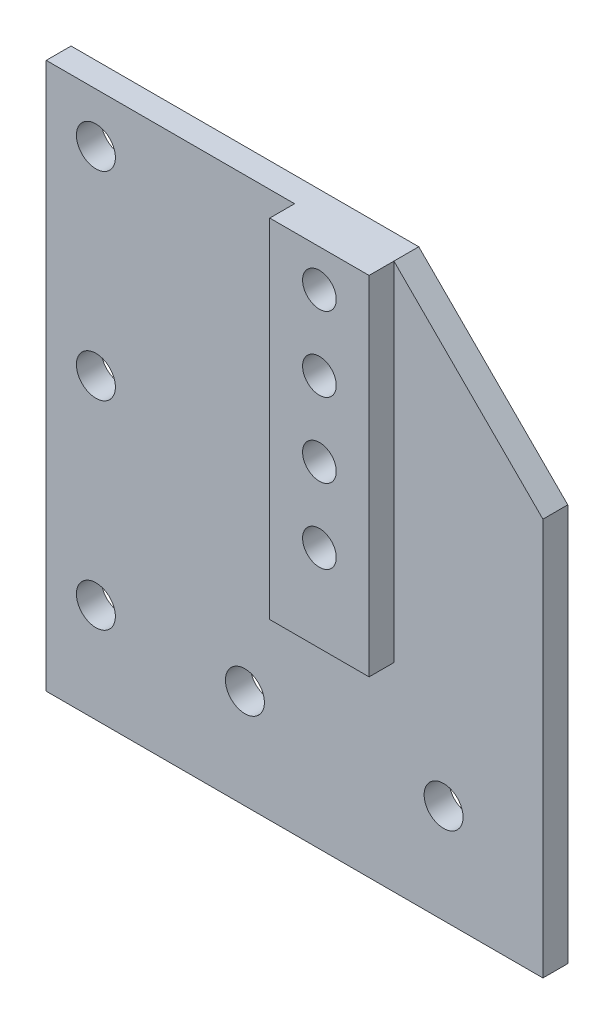
ISO-10303-21;
HEADER;
FILE_DESCRIPTION(('STEP AP214'),'2;1');
FILE_NAME('part.step','',(''),(''),'','','');
FILE_SCHEMA(('AUTOMOTIVE_DESIGN { 1 0 10303 214 1 1 1 1 }'));
ENDSEC;
DATA;
#1=APPLICATION_CONTEXT('core data for automotive mechanical design processes');
#2=APPLICATION_PROTOCOL_DEFINITION('international standard','automotive_design',2000,#1);
#3=PRODUCT_CONTEXT('',#1,'mechanical');
#4=PRODUCT('Part','Part','',(#3));
#5=PRODUCT_RELATED_PRODUCT_CATEGORY('part','',(#4));
#6=PRODUCT_DEFINITION_FORMATION('','',#4);
#7=PRODUCT_DEFINITION_CONTEXT('part definition',#1,'design');
#8=PRODUCT_DEFINITION('design','',#6,#7);
#9=PRODUCT_DEFINITION_SHAPE('','',#8);
#10=(LENGTH_UNIT() NAMED_UNIT(*) SI_UNIT(.MILLI.,.METRE.));
#11=(NAMED_UNIT(*) PLANE_ANGLE_UNIT() SI_UNIT($,.RADIAN.));
#12=(NAMED_UNIT(*) SI_UNIT($,.STERADIAN.) SOLID_ANGLE_UNIT());
#13=UNCERTAINTY_MEASURE_WITH_UNIT(LENGTH_MEASURE(1.E-05),#10,'distance_accuracy_value','');
#14=(GEOMETRIC_REPRESENTATION_CONTEXT(3) GLOBAL_UNCERTAINTY_ASSIGNED_CONTEXT((#13)) GLOBAL_UNIT_ASSIGNED_CONTEXT((#10,
#11,#12)) REPRESENTATION_CONTEXT('',''));
#15=CARTESIAN_POINT('',(0.,0.,0.));
#16=DIRECTION('',(0.,0.,1.));
#17=DIRECTION('',(1.,0.,0.));
#18=AXIS2_PLACEMENT_3D('',#15,#16,#17);
#19=CARTESIAN_POINT('',(-203.200000508,12.7,3.175));
#20=DIRECTION('',(-1.,0.,0.));
#21=DIRECTION('',(0.,0.,1.));
#22=AXIS2_PLACEMENT_3D('',#19,#20,#21);
#23=PLANE('',#22);
#24=DIRECTION('',(0.,1.,0.));
#25=VECTOR('',#24,1.);
#26=CARTESIAN_POINT('',(-203.200000508,12.7,0.));
#27=LINE('',#26,#25);
#28=CARTESIAN_POINT('',(-203.200000508,-12.7,0.));
#29=VERTEX_POINT('',#28);
#30=CARTESIAN_POINT('',(-203.200000508,38.1,0.));
#31=VERTEX_POINT('',#30);
#32=EDGE_CURVE('E160',#29,#31,#27,.T.);
#33=ORIENTED_EDGE('',*,*,#32,.T.);
#34=DIRECTION('',(0.,0.,-1.));
#35=VECTOR('',#34,1.);
#36=CARTESIAN_POINT('',(-203.200000508,38.1,3.175));
#37=LINE('',#36,#35);
#38=CARTESIAN_POINT('',(-203.200000508,38.1,3.175));
#39=VERTEX_POINT('',#38);
#40=EDGE_CURVE('E44',#39,#31,#37,.T.);
#41=ORIENTED_EDGE('',*,*,#40,.F.);
#42=DIRECTION('',(0.,1.,0.));
#43=VECTOR('',#42,1.);
#44=CARTESIAN_POINT('',(-203.200000508,-12.7,3.175));
#45=LINE('',#44,#43);
#46=CARTESIAN_POINT('',(-203.200000508,-12.7,3.175));
#47=VERTEX_POINT('',#46);
#48=EDGE_CURVE('E164',#47,#39,#45,.T.);
#49=ORIENTED_EDGE('',*,*,#48,.F.);
#50=DIRECTION('',(0.,0.,-1.));
#51=VECTOR('',#50,1.);
#52=CARTESIAN_POINT('',(-203.200000508,-12.7,3.175));
#53=LINE('',#52,#51);
#54=EDGE_CURVE('E11',#47,#29,#53,.T.);
#55=ORIENTED_EDGE('',*,*,#54,.T.);
#56=EDGE_LOOP('',(#33,#41,#49,#55));
#57=FACE_BOUND('',#56,.T.);
#58=ADVANCED_FACE('F37',(#57),#23,.F.);
#59=CARTESIAN_POINT('',(-222.250000508,57.1499999999999,3.175));
#60=DIRECTION('',(-0.707106781186548,-0.707106781186548,0.));
#61=DIRECTION('',(0.707106781186548,-0.707106781186548,0.));
#62=AXIS2_PLACEMENT_3D('',#59,#60,#61);
#63=PLANE('',#62);
#64=DIRECTION('',(-0.707106781186547,0.707106781186547,0.));
#65=VECTOR('',#64,1.);
#66=CARTESIAN_POINT('',(-222.250000508,57.1499999999999,0.));
#67=LINE('',#66,#65);
#68=CARTESIAN_POINT('',(-222.250000508,57.1499999999999,0.));
#69=VERTEX_POINT('',#68);
#70=EDGE_CURVE('E176',#31,#69,#67,.T.);
#71=ORIENTED_EDGE('',*,*,#70,.T.);
#72=DIRECTION('',(0.,0.,-1.));
#73=VECTOR('',#72,1.);
#74=CARTESIAN_POINT('',(-222.250000508,57.1499999999999,3.175));
#75=LINE('',#74,#73);
#76=CARTESIAN_POINT('',(-222.250000508,57.1499999999999,3.175));
#77=VERTEX_POINT('',#76);
#78=EDGE_CURVE('E190',#77,#69,#75,.T.);
#79=ORIENTED_EDGE('',*,*,#78,.F.);
#80=DIRECTION('',(-0.707106781186547,0.707106781186547,0.));
#81=VECTOR('',#80,1.);
#82=CARTESIAN_POINT('',(-222.250000508,57.1499999999999,3.175));
#83=LINE('',#82,#81);
#84=EDGE_CURVE('E167',#39,#77,#83,.T.);
#85=ORIENTED_EDGE('',*,*,#84,.F.);
#86=ORIENTED_EDGE('',*,*,#40,.T.);
#87=EDGE_LOOP('',(#71,#79,#85,#86));
#88=FACE_BOUND('',#87,.T.);
#89=ADVANCED_FACE('F196',(#88),#63,.F.);
#90=CARTESIAN_POINT('',(-266.700000508,57.1499999999999,3.175));
#91=DIRECTION('',(0.,-1.,0.));
#92=DIRECTION('',(0.,0.,-1.));
#93=AXIS2_PLACEMENT_3D('',#90,#91,#92);
#94=PLANE('',#93);
#95=DIRECTION('',(-1.,0.,0.));
#96=VECTOR('',#95,1.);
#97=CARTESIAN_POINT('',(-266.700000508,57.1499999999999,0.));
#98=LINE('',#97,#96);
#99=CARTESIAN_POINT('',(-266.700000508,57.1499999999999,0.));
#100=VERTEX_POINT('',#99);
#101=EDGE_CURVE('E179',#69,#100,#98,.T.);
#102=ORIENTED_EDGE('',*,*,#101,.T.);
#103=DIRECTION('',(0.,0.,-1.));
#104=VECTOR('',#103,1.);
#105=CARTESIAN_POINT('',(-266.700000508,57.1499999999999,3.175));
#106=LINE('',#105,#104);
#107=CARTESIAN_POINT('',(-266.700000508,57.1499999999999,3.175));
#108=VERTEX_POINT('',#107);
#109=EDGE_CURVE('E187',#108,#100,#106,.T.);
#110=ORIENTED_EDGE('',*,*,#109,.F.);
#111=DIRECTION('',(-1.,0.,0.));
#112=VECTOR('',#111,1.);
#113=CARTESIAN_POINT('',(-254.000000508,57.1499999999999,3.175));
#114=LINE('',#113,#112);
#115=CARTESIAN_POINT('',(-234.950000508,57.1499999999999,3.175));
#116=VERTEX_POINT('',#115);
#117=EDGE_CURVE('E169',#116,#108,#114,.T.);
#118=ORIENTED_EDGE('',*,*,#117,.F.);
#119=DIRECTION('',(0.,0.,-1.));
#120=VECTOR('',#119,1.);
#121=CARTESIAN_POINT('',(-234.950000508,57.1499999999999,6.35));
#122=LINE('',#121,#120);
#123=CARTESIAN_POINT('',(-234.950000508,57.1499999999999,6.35));
#124=VERTEX_POINT('',#123);
#125=EDGE_CURVE('E110',#124,#116,#122,.T.);
#126=ORIENTED_EDGE('',*,*,#125,.F.);
#127=DIRECTION('',(-1.,0.,0.));
#128=VECTOR('',#127,1.);
#129=CARTESIAN_POINT('',(-222.250000508,57.1499999999999,6.35));
#130=LINE('',#129,#128);
#131=CARTESIAN_POINT('',(-222.250000508,57.1499999999999,6.35));
#132=VERTEX_POINT('',#131);
#133=EDGE_CURVE('E103',#132,#124,#130,.T.);
#134=ORIENTED_EDGE('',*,*,#133,.F.);
#135=DIRECTION('',(0.,0.,-1.));
#136=VECTOR('',#135,1.);
#137=CARTESIAN_POINT('',(-222.250000508,57.1499999999999,6.35));
#138=LINE('',#137,#136);
#139=EDGE_CURVE('E108',#132,#77,#138,.T.);
#140=ORIENTED_EDGE('',*,*,#139,.T.);
#141=ORIENTED_EDGE('',*,*,#78,.T.);
#142=EDGE_LOOP('',(#102,#110,#118,#126,#134,#140,#141));
#143=FACE_BOUND('',#142,.T.);
#144=ADVANCED_FACE('F105',(#143),#94,.F.);
#145=CARTESIAN_POINT('',(-266.700000508,-12.7,3.175));
#146=DIRECTION('',(1.,0.,0.));
#147=DIRECTION('',(0.,1.,0.));
#148=AXIS2_PLACEMENT_3D('',#145,#146,#147);
#149=PLANE('',#148);
#150=DIRECTION('',(0.,-1.,0.));
#151=VECTOR('',#150,1.);
#152=CARTESIAN_POINT('',(-266.700000508,-12.7,0.));
#153=LINE('',#152,#151);
#154=CARTESIAN_POINT('',(-266.700000508,-12.7,0.));
#155=VERTEX_POINT('',#154);
#156=EDGE_CURVE('E181',#100,#155,#153,.T.);
#157=ORIENTED_EDGE('',*,*,#156,.T.);
#158=DIRECTION('',(0.,0.,-1.));
#159=VECTOR('',#158,1.);
#160=CARTESIAN_POINT('',(-266.700000508,-12.7,3.175));
#161=LINE('',#160,#159);
#162=CARTESIAN_POINT('',(-266.700000508,-12.7,3.175));
#163=VERTEX_POINT('',#162);
#164=EDGE_CURVE('E174',#163,#155,#161,.T.);
#165=ORIENTED_EDGE('',*,*,#164,.F.);
#166=DIRECTION('',(0.,-1.,0.));
#167=VECTOR('',#166,1.);
#168=CARTESIAN_POINT('',(-266.700000508,-12.7,3.175));
#169=LINE('',#168,#167);
#170=EDGE_CURVE('E171',#108,#163,#169,.T.);
#171=ORIENTED_EDGE('',*,*,#170,.F.);
#172=ORIENTED_EDGE('',*,*,#109,.T.);
#173=EDGE_LOOP('',(#157,#165,#171,#172));
#174=FACE_BOUND('',#173,.T.);
#175=ADVANCED_FACE('F206',(#174),#149,.F.);
#176=CARTESIAN_POINT('',(-254.000000508,-12.7,3.175));
#177=DIRECTION('',(0.,1.,0.));
#178=DIRECTION('',(-1.,0.,0.));
#179=AXIS2_PLACEMENT_3D('',#176,#177,#178);
#180=PLANE('',#179);
#181=DIRECTION('',(1.,0.,0.));
#182=VECTOR('',#181,1.);
#183=CARTESIAN_POINT('',(-254.000000508,-12.7,0.));
#184=LINE('',#183,#182);
#185=EDGE_CURVE('E165',#155,#29,#184,.T.);
#186=ORIENTED_EDGE('',*,*,#185,.T.);
#187=ORIENTED_EDGE('',*,*,#54,.F.);
#188=DIRECTION('',(1.,0.,0.));
#189=VECTOR('',#188,1.);
#190=CARTESIAN_POINT('',(-254.000000508,-12.7,3.175));
#191=LINE('',#190,#189);
#192=EDGE_CURVE('E161',#163,#47,#191,.T.);
#193=ORIENTED_EDGE('',*,*,#192,.F.);
#194=ORIENTED_EDGE('',*,*,#164,.T.);
#195=EDGE_LOOP('',(#186,#187,#193,#194));
#196=FACE_BOUND('',#195,.T.);
#197=ADVANCED_FACE('F240',(#196),#180,.F.);
#198=CARTESIAN_POINT('',(0.,0.,3.175));
#199=DIRECTION('',(0.,0.,1.));
#200=DIRECTION('',(1.,0.,0.));
#201=AXIS2_PLACEMENT_3D('',#198,#199,#200);
#202=PLANE('',#201);
#203=DIRECTION('',(0.,1.,0.));
#204=VECTOR('',#203,1.);
#205=CARTESIAN_POINT('',(-222.250000508,50.7999999999999,3.175));
#206=LINE('',#205,#204);
#207=CARTESIAN_POINT('',(-222.250000508,12.6999999999999,3.175));
#208=VERTEX_POINT('',#207);
#209=EDGE_CURVE('E51',#208,#77,#206,.T.);
#210=ORIENTED_EDGE('',*,*,#209,.F.);
#211=DIRECTION('',(1.,0.,0.));
#212=VECTOR('',#211,1.);
#213=CARTESIAN_POINT('',(-222.250000508,12.6999999999999,3.175));
#214=LINE('',#213,#212);
#215=CARTESIAN_POINT('',(-234.950000508,12.6999999999999,3.175));
#216=VERTEX_POINT('',#215);
#217=EDGE_CURVE('E220',#216,#208,#214,.T.);
#218=ORIENTED_EDGE('',*,*,#217,.F.);
#219=DIRECTION('',(0.,-1.,0.));
#220=VECTOR('',#219,1.);
#221=CARTESIAN_POINT('',(-234.950000508,57.1499999999999,3.175));
#222=LINE('',#221,#220);
#223=EDGE_CURVE('E57',#116,#216,#222,.T.);
#224=ORIENTED_EDGE('',*,*,#223,.F.);
#225=ORIENTED_EDGE('',*,*,#117,.T.);
#226=ORIENTED_EDGE('',*,*,#170,.T.);
#227=ORIENTED_EDGE('',*,*,#192,.T.);
#228=ORIENTED_EDGE('',*,*,#48,.T.);
#229=ORIENTED_EDGE('',*,*,#84,.T.);
#230=EDGE_LOOP('',(#210,#218,#224,#225,#226,#227,#228,#229));
#231=FACE_BOUND('',#230,.T.);
#232=CARTESIAN_POINT('',(-260.350000508,50.7988669391263,3.175));
#233=DIRECTION('',(0.,0.,1.));
#234=DIRECTION('',(1.,0.,0.));
#235=AXIS2_PLACEMENT_3D('',#232,#233,#234);
#236=CIRCLE('',#235,2.48919999999997);
#237=CARTESIAN_POINT('',(-257.860800508,50.7988669391263,3.175));
#238=VERTEX_POINT('',#237);
#239=EDGE_CURVE('E125',#238,#238,#236,.T.);
#240=ORIENTED_EDGE('',*,*,#239,.F.);
#241=EDGE_LOOP('',(#240));
#242=FACE_BOUND('',#241,.T.);
#243=CARTESIAN_POINT('',(-260.350000508,25.4,3.175));
#244=DIRECTION('',(0.,0.,1.));
#245=DIRECTION('',(1.,0.,0.));
#246=AXIS2_PLACEMENT_3D('',#243,#244,#245);
#247=CIRCLE('',#246,2.48919999999997);
#248=CARTESIAN_POINT('',(-257.860800508,25.4,3.175));
#249=VERTEX_POINT('',#248);
#250=EDGE_CURVE('E136',#249,#249,#247,.T.);
#251=ORIENTED_EDGE('',*,*,#250,.F.);
#252=EDGE_LOOP('',(#251));
#253=FACE_BOUND('',#252,.T.);
#254=CARTESIAN_POINT('',(-260.350000508,0.,3.175));
#255=DIRECTION('',(0.,0.,1.));
#256=DIRECTION('',(1.,0.,0.));
#257=AXIS2_PLACEMENT_3D('',#254,#255,#256);
#258=CIRCLE('',#257,2.48919999999997);
#259=CARTESIAN_POINT('',(-257.860800508,0.,3.175));
#260=VERTEX_POINT('',#259);
#261=EDGE_CURVE('E142',#260,#260,#258,.T.);
#262=ORIENTED_EDGE('',*,*,#261,.F.);
#263=EDGE_LOOP('',(#262));
#264=FACE_BOUND('',#263,.T.);
#265=CARTESIAN_POINT('',(-241.300000508,0.,3.175));
#266=DIRECTION('',(0.,0.,1.));
#267=DIRECTION('',(1.,0.,0.));
#268=AXIS2_PLACEMENT_3D('',#265,#266,#267);
#269=CIRCLE('',#268,2.4892);
#270=CARTESIAN_POINT('',(-238.810800508,0.,3.175));
#271=VERTEX_POINT('',#270);
#272=EDGE_CURVE('E148',#271,#271,#269,.T.);
#273=ORIENTED_EDGE('',*,*,#272,.F.);
#274=EDGE_LOOP('',(#273));
#275=FACE_BOUND('',#274,.T.);
#276=CARTESIAN_POINT('',(-215.900000508,0.,3.175));
#277=DIRECTION('',(0.,0.,1.));
#278=DIRECTION('',(1.,0.,0.));
#279=AXIS2_PLACEMENT_3D('',#276,#277,#278);
#280=CIRCLE('',#279,2.4892);
#281=CARTESIAN_POINT('',(-213.410800508,0.,3.175));
#282=VERTEX_POINT('',#281);
#283=EDGE_CURVE('E154',#282,#282,#280,.T.);
#284=ORIENTED_EDGE('',*,*,#283,.F.);
#285=EDGE_LOOP('',(#284));
#286=FACE_BOUND('',#285,.T.);
#287=ADVANCED_FACE('F208',(#231,#242,#253,#264,#275,#286),#202,.T.);
#288=CARTESIAN_POINT('',(0.,0.,0.));
#289=DIRECTION('',(0.,0.,1.));
#290=DIRECTION('',(1.,0.,0.));
#291=AXIS2_PLACEMENT_3D('',#288,#289,#290);
#292=PLANE('',#291);
#293=CARTESIAN_POINT('',(-228.600000508,42.8624999999999,0.));
#294=DIRECTION('',(0.,0.,1.));
#295=DIRECTION('',(1.,0.,0.));
#296=AXIS2_PLACEMENT_3D('',#293,#294,#295);
#297=CIRCLE('',#296,2.15265000000001);
#298=CARTESIAN_POINT('',(-226.447350508,42.8624999999999,0.));
#299=VERTEX_POINT('',#298);
#300=EDGE_CURVE('E437',#299,#299,#297,.T.);
#301=ORIENTED_EDGE('',*,*,#300,.T.);
#302=EDGE_LOOP('',(#301));
#303=FACE_BOUND('',#302,.T.);
#304=CARTESIAN_POINT('',(-228.600000508,52.3874999999999,0.));
#305=DIRECTION('',(0.,0.,1.));
#306=DIRECTION('',(1.,0.,0.));
#307=AXIS2_PLACEMENT_3D('',#304,#305,#306);
#308=CIRCLE('',#307,2.15265000000001);
#309=CARTESIAN_POINT('',(-226.447350508,52.3874999999999,0.));
#310=VERTEX_POINT('',#309);
#311=EDGE_CURVE('E447',#310,#310,#308,.T.);
#312=ORIENTED_EDGE('',*,*,#311,.T.);
#313=EDGE_LOOP('',(#312));
#314=FACE_BOUND('',#313,.T.);
#315=CARTESIAN_POINT('',(-228.600000508,33.3374999999999,0.));
#316=DIRECTION('',(0.,0.,1.));
#317=DIRECTION('',(1.,0.,0.));
#318=AXIS2_PLACEMENT_3D('',#315,#316,#317);
#319=CIRCLE('',#318,2.15265000000001);
#320=CARTESIAN_POINT('',(-226.447350508,33.3374999999999,0.));
#321=VERTEX_POINT('',#320);
#322=EDGE_CURVE('E453',#321,#321,#319,.T.);
#323=ORIENTED_EDGE('',*,*,#322,.T.);
#324=EDGE_LOOP('',(#323));
#325=FACE_BOUND('',#324,.T.);
#326=CARTESIAN_POINT('',(-228.600000508,23.8125,0.));
#327=DIRECTION('',(0.,0.,1.));
#328=DIRECTION('',(1.,0.,0.));
#329=AXIS2_PLACEMENT_3D('',#326,#327,#328);
#330=CIRCLE('',#329,2.15265000000001);
#331=CARTESIAN_POINT('',(-226.447350508,23.8125,0.));
#332=VERTEX_POINT('',#331);
#333=EDGE_CURVE('E221',#332,#332,#330,.T.);
#334=ORIENTED_EDGE('',*,*,#333,.T.);
#335=EDGE_LOOP('',(#334));
#336=FACE_BOUND('',#335,.T.);
#337=CARTESIAN_POINT('',(-260.350000508,50.7988669391263,0.));
#338=DIRECTION('',(0.,0.,1.));
#339=DIRECTION('',(1.,0.,0.));
#340=AXIS2_PLACEMENT_3D('',#337,#338,#339);
#341=CIRCLE('',#340,2.48920000000002);
#342=CARTESIAN_POINT('',(-257.860800508,50.7988669391263,0.));
#343=VERTEX_POINT('',#342);
#344=EDGE_CURVE('E128',#343,#343,#341,.T.);
#345=ORIENTED_EDGE('',*,*,#344,.T.);
#346=EDGE_LOOP('',(#345));
#347=FACE_BOUND('',#346,.T.);
#348=CARTESIAN_POINT('',(-260.350000508,25.4,0.));
#349=DIRECTION('',(0.,0.,1.));
#350=DIRECTION('',(1.,0.,0.));
#351=AXIS2_PLACEMENT_3D('',#348,#349,#350);
#352=CIRCLE('',#351,2.48920000000002);
#353=CARTESIAN_POINT('',(-257.860800508,25.4,0.));
#354=VERTEX_POINT('',#353);
#355=EDGE_CURVE('E139',#354,#354,#352,.T.);
#356=ORIENTED_EDGE('',*,*,#355,.T.);
#357=EDGE_LOOP('',(#356));
#358=FACE_BOUND('',#357,.T.);
#359=CARTESIAN_POINT('',(-260.350000508,0.,0.));
#360=DIRECTION('',(0.,0.,1.));
#361=DIRECTION('',(1.,0.,0.));
#362=AXIS2_PLACEMENT_3D('',#359,#360,#361);
#363=CIRCLE('',#362,2.48920000000002);
#364=CARTESIAN_POINT('',(-257.860800508,0.,0.));
#365=VERTEX_POINT('',#364);
#366=EDGE_CURVE('E145',#365,#365,#363,.T.);
#367=ORIENTED_EDGE('',*,*,#366,.T.);
#368=EDGE_LOOP('',(#367));
#369=FACE_BOUND('',#368,.T.);
#370=CARTESIAN_POINT('',(-241.300000508,0.,0.));
#371=DIRECTION('',(0.,0.,1.));
#372=DIRECTION('',(1.,0.,0.));
#373=AXIS2_PLACEMENT_3D('',#370,#371,#372);
#374=CIRCLE('',#373,2.4892);
#375=CARTESIAN_POINT('',(-238.810800508,0.,0.));
#376=VERTEX_POINT('',#375);
#377=EDGE_CURVE('E151',#376,#376,#374,.T.);
#378=ORIENTED_EDGE('',*,*,#377,.T.);
#379=EDGE_LOOP('',(#378));
#380=FACE_BOUND('',#379,.T.);
#381=CARTESIAN_POINT('',(-215.900000508,0.,0.));
#382=DIRECTION('',(0.,0.,1.));
#383=DIRECTION('',(1.,0.,0.));
#384=AXIS2_PLACEMENT_3D('',#381,#382,#383);
#385=CIRCLE('',#384,2.4892);
#386=CARTESIAN_POINT('',(-213.410800508,0.,0.));
#387=VERTEX_POINT('',#386);
#388=EDGE_CURVE('E157',#387,#387,#385,.T.);
#389=ORIENTED_EDGE('',*,*,#388,.T.);
#390=EDGE_LOOP('',(#389));
#391=FACE_BOUND('',#390,.T.);
#392=ORIENTED_EDGE('',*,*,#32,.F.);
#393=ORIENTED_EDGE('',*,*,#185,.F.);
#394=ORIENTED_EDGE('',*,*,#156,.F.);
#395=ORIENTED_EDGE('',*,*,#101,.F.);
#396=ORIENTED_EDGE('',*,*,#70,.F.);
#397=EDGE_LOOP('',(#392,#393,#394,#395,#396));
#398=FACE_BOUND('',#397,.T.);
#399=ADVANCED_FACE('F200',(#303,#314,#325,#336,#347,#358,#369,#380,#391,#398),#292,.F.);
#400=CARTESIAN_POINT('',(-215.900000508,0.,3.175));
#401=DIRECTION('',(0.,0.,1.));
#402=DIRECTION('',(1.,0.,0.));
#403=AXIS2_PLACEMENT_3D('',#400,#401,#402);
#404=CYLINDRICAL_SURFACE('',#403,2.4892);
#405=ORIENTED_EDGE('',*,*,#388,.F.);
#406=EDGE_LOOP('',(#405));
#407=FACE_BOUND('',#406,.T.);
#408=ORIENTED_EDGE('',*,*,#283,.T.);
#409=EDGE_LOOP('',(#408));
#410=FACE_BOUND('',#409,.T.);
#411=ADVANCED_FACE('F276',(#407,#410),#404,.F.);
#412=CARTESIAN_POINT('',(-241.300000508,0.,3.175));
#413=DIRECTION('',(0.,0.,1.));
#414=DIRECTION('',(1.,0.,0.));
#415=AXIS2_PLACEMENT_3D('',#412,#413,#414);
#416=CYLINDRICAL_SURFACE('',#415,2.4892);
#417=ORIENTED_EDGE('',*,*,#377,.F.);
#418=EDGE_LOOP('',(#417));
#419=FACE_BOUND('',#418,.T.);
#420=ORIENTED_EDGE('',*,*,#272,.T.);
#421=EDGE_LOOP('',(#420));
#422=FACE_BOUND('',#421,.T.);
#423=ADVANCED_FACE('F281',(#419,#422),#416,.F.);
#424=CARTESIAN_POINT('',(-260.350000508,0.,3.175));
#425=DIRECTION('',(0.,0.,1.));
#426=DIRECTION('',(1.,0.,0.));
#427=AXIS2_PLACEMENT_3D('',#424,#425,#426);
#428=CYLINDRICAL_SURFACE('',#427,2.4892);
#429=ORIENTED_EDGE('',*,*,#366,.F.);
#430=EDGE_LOOP('',(#429));
#431=FACE_BOUND('',#430,.T.);
#432=ORIENTED_EDGE('',*,*,#261,.T.);
#433=EDGE_LOOP('',(#432));
#434=FACE_BOUND('',#433,.T.);
#435=ADVANCED_FACE('F294',(#431,#434),#428,.F.);
#436=CARTESIAN_POINT('',(-260.350000508,25.4,3.175));
#437=DIRECTION('',(0.,0.,1.));
#438=DIRECTION('',(1.,0.,0.));
#439=AXIS2_PLACEMENT_3D('',#436,#437,#438);
#440=CYLINDRICAL_SURFACE('',#439,2.4892);
#441=ORIENTED_EDGE('',*,*,#355,.F.);
#442=EDGE_LOOP('',(#441));
#443=FACE_BOUND('',#442,.T.);
#444=ORIENTED_EDGE('',*,*,#250,.T.);
#445=EDGE_LOOP('',(#444));
#446=FACE_BOUND('',#445,.T.);
#447=ADVANCED_FACE('F305',(#443,#446),#440,.F.);
#448=CARTESIAN_POINT('',(-260.350000508,50.7988669391263,3.175));
#449=DIRECTION('',(0.,0.,1.));
#450=DIRECTION('',(1.,0.,0.));
#451=AXIS2_PLACEMENT_3D('',#448,#449,#450);
#452=CYLINDRICAL_SURFACE('',#451,2.4892);
#453=ORIENTED_EDGE('',*,*,#344,.F.);
#454=EDGE_LOOP('',(#453));
#455=FACE_BOUND('',#454,.T.);
#456=ORIENTED_EDGE('',*,*,#239,.T.);
#457=EDGE_LOOP('',(#456));
#458=FACE_BOUND('',#457,.T.);
#459=ADVANCED_FACE('F233',(#455,#458),#452,.F.);
#460=CARTESIAN_POINT('',(-234.950000508,57.1499999999999,6.35));
#461=DIRECTION('',(1.,0.,0.));
#462=DIRECTION('',(0.,0.,-1.));
#463=AXIS2_PLACEMENT_3D('',#460,#461,#462);
#464=PLANE('',#463);
#465=ORIENTED_EDGE('',*,*,#223,.T.);
#466=DIRECTION('',(0.,0.,-1.));
#467=VECTOR('',#466,1.);
#468=CARTESIAN_POINT('',(-234.950000508,12.6999999999999,6.35));
#469=LINE('',#468,#467);
#470=CARTESIAN_POINT('',(-234.950000508,12.6999999999999,6.35));
#471=VERTEX_POINT('',#470);
#472=EDGE_CURVE('E130',#471,#216,#469,.T.);
#473=ORIENTED_EDGE('',*,*,#472,.F.);
#474=DIRECTION('',(0.,-1.,0.));
#475=VECTOR('',#474,1.);
#476=CARTESIAN_POINT('',(-234.950000508,57.1499999999999,6.35));
#477=LINE('',#476,#475);
#478=EDGE_CURVE('E113',#124,#471,#477,.T.);
#479=ORIENTED_EDGE('',*,*,#478,.F.);
#480=ORIENTED_EDGE('',*,*,#125,.T.);
#481=EDGE_LOOP('',(#465,#473,#479,#480));
#482=FACE_BOUND('',#481,.T.);
#483=ADVANCED_FACE('F212',(#482),#464,.F.);
#484=CARTESIAN_POINT('',(-222.250000508,12.6999999999999,6.35));
#485=DIRECTION('',(0.,1.,0.));
#486=DIRECTION('',(-1.,0.,0.));
#487=AXIS2_PLACEMENT_3D('',#484,#485,#486);
#488=PLANE('',#487);
#489=ORIENTED_EDGE('',*,*,#217,.T.);
#490=DIRECTION('',(0.,0.,-1.));
#491=VECTOR('',#490,1.);
#492=CARTESIAN_POINT('',(-222.250000508,12.6999999999999,6.35));
#493=LINE('',#492,#491);
#494=CARTESIAN_POINT('',(-222.250000508,12.6999999999999,6.35));
#495=VERTEX_POINT('',#494);
#496=EDGE_CURVE('E216',#495,#208,#493,.T.);
#497=ORIENTED_EDGE('',*,*,#496,.F.);
#498=DIRECTION('',(1.,0.,0.));
#499=VECTOR('',#498,1.);
#500=CARTESIAN_POINT('',(-222.250000508,12.6999999999999,6.35));
#501=LINE('',#500,#499);
#502=EDGE_CURVE('E119',#471,#495,#501,.T.);
#503=ORIENTED_EDGE('',*,*,#502,.F.);
#504=ORIENTED_EDGE('',*,*,#472,.T.);
#505=EDGE_LOOP('',(#489,#497,#503,#504));
#506=FACE_BOUND('',#505,.T.);
#507=ADVANCED_FACE('F225',(#506),#488,.F.);
#508=CARTESIAN_POINT('',(-222.250000508,50.7999999999999,6.35));
#509=DIRECTION('',(-1.,0.,0.));
#510=DIRECTION('',(0.,0.,1.));
#511=AXIS2_PLACEMENT_3D('',#508,#509,#510);
#512=PLANE('',#511);
#513=ORIENTED_EDGE('',*,*,#209,.T.);
#514=ORIENTED_EDGE('',*,*,#139,.F.);
#515=DIRECTION('',(0.,1.,0.));
#516=VECTOR('',#515,1.);
#517=CARTESIAN_POINT('',(-222.250000508,50.7999999999999,6.35));
#518=LINE('',#517,#516);
#519=EDGE_CURVE('E114',#495,#132,#518,.T.);
#520=ORIENTED_EDGE('',*,*,#519,.F.);
#521=ORIENTED_EDGE('',*,*,#496,.T.);
#522=EDGE_LOOP('',(#513,#514,#520,#521));
#523=FACE_BOUND('',#522,.T.);
#524=ADVANCED_FACE('F124',(#523),#512,.F.);
#525=CARTESIAN_POINT('',(0.,0.,6.35));
#526=DIRECTION('',(0.,0.,1.));
#527=DIRECTION('',(1.,0.,0.));
#528=AXIS2_PLACEMENT_3D('',#525,#526,#527);
#529=PLANE('',#528);
#530=CARTESIAN_POINT('',(-228.600000508,42.8624999999999,6.35));
#531=DIRECTION('',(0.,0.,1.));
#532=DIRECTION('',(1.,0.,0.));
#533=AXIS2_PLACEMENT_3D('',#530,#531,#532);
#534=CIRCLE('',#533,2.15265000000001);
#535=CARTESIAN_POINT('',(-226.447350508,42.8624999999999,6.35));
#536=VERTEX_POINT('',#535);
#537=EDGE_CURVE('E440',#536,#536,#534,.T.);
#538=ORIENTED_EDGE('',*,*,#537,.F.);
#539=EDGE_LOOP('',(#538));
#540=FACE_BOUND('',#539,.T.);
#541=CARTESIAN_POINT('',(-228.600000508,52.3874999999999,6.35));
#542=DIRECTION('',(0.,0.,1.));
#543=DIRECTION('',(1.,0.,0.));
#544=AXIS2_PLACEMENT_3D('',#541,#542,#543);
#545=CIRCLE('',#544,2.15265000000001);
#546=CARTESIAN_POINT('',(-226.447350508,52.3874999999999,6.35));
#547=VERTEX_POINT('',#546);
#548=EDGE_CURVE('E442',#547,#547,#545,.T.);
#549=ORIENTED_EDGE('',*,*,#548,.F.);
#550=EDGE_LOOP('',(#549));
#551=FACE_BOUND('',#550,.T.);
#552=CARTESIAN_POINT('',(-228.600000508,33.3374999999999,6.35));
#553=DIRECTION('',(0.,0.,1.));
#554=DIRECTION('',(1.,0.,0.));
#555=AXIS2_PLACEMENT_3D('',#552,#553,#554);
#556=CIRCLE('',#555,2.15265000000001);
#557=CARTESIAN_POINT('',(-226.447350508,33.3374999999999,6.35));
#558=VERTEX_POINT('',#557);
#559=EDGE_CURVE('E450',#558,#558,#556,.T.);
#560=ORIENTED_EDGE('',*,*,#559,.F.);
#561=EDGE_LOOP('',(#560));
#562=FACE_BOUND('',#561,.T.);
#563=CARTESIAN_POINT('',(-228.600000508,23.8125,6.35));
#564=DIRECTION('',(0.,0.,1.));
#565=DIRECTION('',(1.,0.,0.));
#566=AXIS2_PLACEMENT_3D('',#563,#564,#565);
#567=CIRCLE('',#566,2.15265000000001);
#568=CARTESIAN_POINT('',(-226.447350508,23.8125,6.35));
#569=VERTEX_POINT('',#568);
#570=EDGE_CURVE('E456',#569,#569,#567,.T.);
#571=ORIENTED_EDGE('',*,*,#570,.F.);
#572=EDGE_LOOP('',(#571));
#573=FACE_BOUND('',#572,.T.);
#574=ORIENTED_EDGE('',*,*,#519,.T.);
#575=ORIENTED_EDGE('',*,*,#133,.T.);
#576=ORIENTED_EDGE('',*,*,#478,.T.);
#577=ORIENTED_EDGE('',*,*,#502,.T.);
#578=EDGE_LOOP('',(#574,#575,#576,#577));
#579=FACE_BOUND('',#578,.T.);
#580=ADVANCED_FACE('F117',(#540,#551,#562,#573,#579),#529,.T.);
#581=CARTESIAN_POINT('',(-228.600000508,23.8125,6.35));
#582=DIRECTION('',(0.,0.,1.));
#583=DIRECTION('',(1.,0.,0.));
#584=AXIS2_PLACEMENT_3D('',#581,#582,#583);
#585=CYLINDRICAL_SURFACE('',#584,2.15265000000001);
#586=ORIENTED_EDGE('',*,*,#333,.F.);
#587=EDGE_LOOP('',(#586));
#588=FACE_BOUND('',#587,.T.);
#589=ORIENTED_EDGE('',*,*,#570,.T.);
#590=EDGE_LOOP('',(#589));
#591=FACE_BOUND('',#590,.T.);
#592=ADVANCED_FACE('F381',(#588,#591),#585,.F.);
#593=CARTESIAN_POINT('',(-228.600000508,33.3374999999999,6.35));
#594=DIRECTION('',(0.,0.,1.));
#595=DIRECTION('',(1.,0.,0.));
#596=AXIS2_PLACEMENT_3D('',#593,#594,#595);
#597=CYLINDRICAL_SURFACE('',#596,2.15265000000001);
#598=ORIENTED_EDGE('',*,*,#322,.F.);
#599=EDGE_LOOP('',(#598));
#600=FACE_BOUND('',#599,.T.);
#601=ORIENTED_EDGE('',*,*,#559,.T.);
#602=EDGE_LOOP('',(#601));
#603=FACE_BOUND('',#602,.T.);
#604=ADVANCED_FACE('F392',(#600,#603),#597,.F.);
#605=CARTESIAN_POINT('',(-228.600000508,52.3874999999999,6.35));
#606=DIRECTION('',(0.,0.,1.));
#607=DIRECTION('',(1.,0.,0.));
#608=AXIS2_PLACEMENT_3D('',#605,#606,#607);
#609=CYLINDRICAL_SURFACE('',#608,2.15265000000001);
#610=ORIENTED_EDGE('',*,*,#311,.F.);
#611=EDGE_LOOP('',(#610));
#612=FACE_BOUND('',#611,.T.);
#613=ORIENTED_EDGE('',*,*,#548,.T.);
#614=EDGE_LOOP('',(#613));
#615=FACE_BOUND('',#614,.T.);
#616=ADVANCED_FACE('F403',(#612,#615),#609,.F.);
#617=CARTESIAN_POINT('',(-228.600000508,42.8624999999999,6.35));
#618=DIRECTION('',(0.,0.,1.));
#619=DIRECTION('',(1.,0.,0.));
#620=AXIS2_PLACEMENT_3D('',#617,#618,#619);
#621=CYLINDRICAL_SURFACE('',#620,2.15265000000001);
#622=ORIENTED_EDGE('',*,*,#300,.F.);
#623=EDGE_LOOP('',(#622));
#624=FACE_BOUND('',#623,.T.);
#625=ORIENTED_EDGE('',*,*,#537,.T.);
#626=EDGE_LOOP('',(#625));
#627=FACE_BOUND('',#626,.T.);
#628=ADVANCED_FACE('F414',(#624,#627),#621,.F.);
#629=CLOSED_SHELL('',(#58,#89,#144,#175,#197,#287,#399,#411,#423,#435,#447,#459,#483,#507,#524,
#580,#592,#604,#616,#628));
#630=MANIFOLD_SOLID_BREP('B2',#629);
#631=ADVANCED_BREP_SHAPE_REPRESENTATION('',(#18,#630),#14);
#632=SHAPE_DEFINITION_REPRESENTATION(#9,#631);
ENDSEC;
END-ISO-10303-21;
